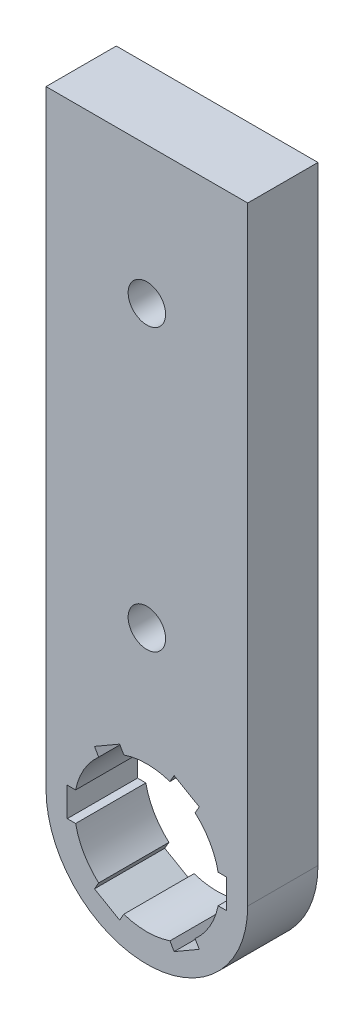
ISO-10303-21;
HEADER;
FILE_DESCRIPTION(('STEP AP214'),'2;1');
FILE_NAME('part.step','',(''),(''),'','','');
FILE_SCHEMA(('AUTOMOTIVE_DESIGN { 1 0 10303 214 1 1 1 1 }'));
ENDSEC;
DATA;
#1=APPLICATION_CONTEXT('core data for automotive mechanical design processes');
#2=APPLICATION_PROTOCOL_DEFINITION('international standard','automotive_design',2000,#1);
#3=PRODUCT_CONTEXT('',#1,'mechanical');
#4=PRODUCT('Part','Part','',(#3));
#5=PRODUCT_RELATED_PRODUCT_CATEGORY('part','',(#4));
#6=PRODUCT_DEFINITION_FORMATION('','',#4);
#7=PRODUCT_DEFINITION_CONTEXT('part definition',#1,'design');
#8=PRODUCT_DEFINITION('design','',#6,#7);
#9=PRODUCT_DEFINITION_SHAPE('','',#8);
#10=(LENGTH_UNIT() NAMED_UNIT(*) SI_UNIT(.MILLI.,.METRE.));
#11=(NAMED_UNIT(*) PLANE_ANGLE_UNIT() SI_UNIT($,.RADIAN.));
#12=(NAMED_UNIT(*) SI_UNIT($,.STERADIAN.) SOLID_ANGLE_UNIT());
#13=UNCERTAINTY_MEASURE_WITH_UNIT(LENGTH_MEASURE(1.E-05),#10,'distance_accuracy_value','');
#14=(GEOMETRIC_REPRESENTATION_CONTEXT(3) GLOBAL_UNCERTAINTY_ASSIGNED_CONTEXT((#13)) GLOBAL_UNIT_ASSIGNED_CONTEXT((#10,
#11,#12)) REPRESENTATION_CONTEXT('',''));
#15=CARTESIAN_POINT('',(0.,0.,0.));
#16=DIRECTION('',(0.,0.,1.));
#17=DIRECTION('',(1.,0.,0.));
#18=AXIS2_PLACEMENT_3D('',#15,#16,#17);
#19=CARTESIAN_POINT('',(0.,-32.5,7.5));
#20=DIRECTION('',(0.,0.,1.));
#21=DIRECTION('',(1.,0.,0.));
#22=AXIS2_PLACEMENT_3D('',#19,#20,#21);
#23=PLANE('',#22);
#24=CARTESIAN_POINT('',(0.,-12.165,7.5));
#25=DIRECTION('',(0.,0.,1.));
#26=DIRECTION('',(-1.,0.,0.));
#27=AXIS2_PLACEMENT_3D('',#24,#25,#26);
#28=CIRCLE('',#27,2.);
#29=CARTESIAN_POINT('',(-2.,-12.165,7.5));
#30=VERTEX_POINT('',#29);
#31=EDGE_CURVE('E719',#30,#30,#28,.T.);
#32=ORIENTED_EDGE('',*,*,#31,.F.);
#33=EDGE_LOOP('',(#32));
#34=FACE_BOUND('',#33,.T.);
#35=CARTESIAN_POINT('',(0.,-32.5,7.5));
#36=DIRECTION('',(0.,0.,1.));
#37=DIRECTION('',(1.,0.,0.));
#38=AXIS2_PLACEMENT_3D('',#35,#36,#37);
#39=CIRCLE('',#38,10.765);
#40=CARTESIAN_POINT('',(-10.765,-32.5,7.5));
#41=VERTEX_POINT('',#40);
#42=CARTESIAN_POINT('',(10.765,-32.5,7.5));
#43=VERTEX_POINT('',#42);
#44=EDGE_CURVE('E689',#41,#43,#39,.T.);
#45=ORIENTED_EDGE('',*,*,#44,.T.);
#46=DIRECTION('',(0.,1.,0.));
#47=VECTOR('',#46,1.);
#48=CARTESIAN_POINT('',(10.765,32.5,7.5));
#49=LINE('',#48,#47);
#50=CARTESIAN_POINT('',(10.765,32.5,7.5));
#51=VERTEX_POINT('',#50);
#52=EDGE_CURVE('E706',#43,#51,#49,.T.);
#53=ORIENTED_EDGE('',*,*,#52,.T.);
#54=DIRECTION('',(-1.,0.,0.));
#55=VECTOR('',#54,1.);
#56=CARTESIAN_POINT('',(-10.765,32.5,7.5));
#57=LINE('',#56,#55);
#58=CARTESIAN_POINT('',(-10.765,32.5,7.5));
#59=VERTEX_POINT('',#58);
#60=EDGE_CURVE('E681',#51,#59,#57,.T.);
#61=ORIENTED_EDGE('',*,*,#60,.T.);
#62=DIRECTION('',(0.,-1.,0.));
#63=VECTOR('',#62,1.);
#64=CARTESIAN_POINT('',(-10.765,32.5,7.5));
#65=LINE('',#64,#63);
#66=EDGE_CURVE('E697',#59,#41,#65,.T.);
#67=ORIENTED_EDGE('',*,*,#66,.T.);
#68=EDGE_LOOP('',(#45,#53,#61,#67));
#69=FACE_BOUND('',#68,.T.);
#70=CARTESIAN_POINT('',(0.,17.835,7.5));
#71=DIRECTION('',(0.,0.,1.));
#72=DIRECTION('',(1.,0.,0.));
#73=AXIS2_PLACEMENT_3D('',#70,#71,#72);
#74=CIRCLE('',#73,2.);
#75=CARTESIAN_POINT('',(2.,17.835,7.5));
#76=VERTEX_POINT('',#75);
#77=EDGE_CURVE('E710',#76,#76,#74,.T.);
#78=ORIENTED_EDGE('',*,*,#77,.F.);
#79=EDGE_LOOP('',(#78));
#80=FACE_BOUND('',#79,.T.);
#81=DIRECTION('',(0.,1.,0.));
#82=VECTOR('',#81,1.);
#83=CARTESIAN_POINT('',(-8.50000000000002,0.,7.5));
#84=LINE('',#83,#82);
#85=CARTESIAN_POINT('',(-8.50000000000004,-34.05,7.5));
#86=VERTEX_POINT('',#85);
#87=CARTESIAN_POINT('',(-8.50000000000004,-30.95,7.5));
#88=VERTEX_POINT('',#87);
#89=EDGE_CURVE('E406',#86,#88,#84,.T.);
#90=ORIENTED_EDGE('',*,*,#89,.T.);
#91=DIRECTION('',(1.,0.,0.));
#92=VECTOR('',#91,1.);
#93=CARTESIAN_POINT('',(0.,-30.95,7.5));
#94=LINE('',#93,#92);
#95=CARTESIAN_POINT('',(-7.60872689745145,-30.95,7.5));
#96=VERTEX_POINT('',#95);
#97=EDGE_CURVE('E401',#88,#96,#94,.T.);
#98=ORIENTED_EDGE('',*,*,#97,.T.);
#99=CARTESIAN_POINT('',(0.,-32.5,7.5));
#100=DIRECTION('',(0.,0.,1.));
#101=DIRECTION('',(1.,0.,0.));
#102=AXIS2_PLACEMENT_3D('',#99,#100,#101);
#103=CIRCLE('',#102,7.76500000000004);
#104=CARTESIAN_POINT('',(-5.14670282459161,-26.6856492163491,7.5));
#105=VERTEX_POINT('',#104);
#106=EDGE_CURVE('E359',#105,#96,#103,.T.);
#107=ORIENTED_EDGE('',*,*,#106,.F.);
#108=DIRECTION('',(0.499999999999999,-0.86602540378444,0.));
#109=VECTOR('',#108,1.);
#110=CARTESIAN_POINT('',(-15.415252187363,-8.89999999999996,7.5));
#111=LINE('',#110,#109);
#112=CARTESIAN_POINT('',(-5.5923393758659,-25.9137840678323,7.5));
#113=VERTEX_POINT('',#112);
#114=EDGE_CURVE('E334',#113,#105,#111,.T.);
#115=ORIENTED_EDGE('',*,*,#114,.F.);
#116=DIRECTION('',(0.86602540378444,0.499999999999998,0.));
#117=VECTOR('',#116,1.);
#118=CARTESIAN_POINT('',(9.8229128114971,-17.0137840678323,7.5));
#119=LINE('',#118,#117);
#120=CARTESIAN_POINT('',(-2.90766062413413,-24.3637840678323,7.5));
#121=VERTEX_POINT('',#120);
#122=EDGE_CURVE('E606',#113,#121,#119,.T.);
#123=ORIENTED_EDGE('',*,*,#122,.T.);
#124=DIRECTION('',(0.499999999999998,-0.86602540378444,0.));
#125=VECTOR('',#124,1.);
#126=CARTESIAN_POINT('',(-12.7305734356312,-7.34999999999994,7.5));
#127=LINE('',#126,#125);
#128=CARTESIAN_POINT('',(-2.46202407285984,-25.1356492163491,7.5));
#129=VERTEX_POINT('',#128);
#130=EDGE_CURVE('E602',#121,#129,#127,.T.);
#131=ORIENTED_EDGE('',*,*,#130,.T.);
#132=CARTESIAN_POINT('',(2.46202407285982,-25.1356492163491,7.5));
#133=VERTEX_POINT('',#132);
#134=EDGE_CURVE('E328',#133,#129,#103,.T.);
#135=ORIENTED_EDGE('',*,*,#134,.F.);
#136=DIRECTION('',(-0.500000000000004,-0.866025403784437,0.));
#137=VECTOR('',#136,1.);
#138=CARTESIAN_POINT('',(12.7305734356313,-7.3500000000001,7.5));
#139=LINE('',#138,#137);
#140=CARTESIAN_POINT('',(2.90766062413413,-24.3637840678323,7.5));
#141=VERTEX_POINT('',#140);
#142=EDGE_CURVE('E545',#141,#133,#139,.T.);
#143=ORIENTED_EDGE('',*,*,#142,.F.);
#144=DIRECTION('',(0.866025403784436,-0.500000000000004,0.));
#145=VECTOR('',#144,1.);
#146=CARTESIAN_POINT('',(-9.82291281149717,-17.0137840678322,7.5));
#147=LINE('',#146,#145);
#148=CARTESIAN_POINT('',(5.59233937586589,-25.9137840678323,7.5));
#149=VERTEX_POINT('',#148);
#150=EDGE_CURVE('E541',#141,#149,#147,.T.);
#151=ORIENTED_EDGE('',*,*,#150,.T.);
#152=DIRECTION('',(-0.500000000000004,-0.866025403784436,0.));
#153=VECTOR('',#152,1.);
#154=CARTESIAN_POINT('',(15.4152521873631,-8.90000000000012,7.5));
#155=LINE('',#154,#153);
#156=CARTESIAN_POINT('',(5.14670282459158,-26.6856492163492,7.5));
#157=VERTEX_POINT('',#156);
#158=EDGE_CURVE('E537',#149,#157,#155,.T.);
#159=ORIENTED_EDGE('',*,*,#158,.T.);
#160=CARTESIAN_POINT('',(7.60872689745138,-30.95,7.5));
#161=VERTEX_POINT('',#160);
#162=EDGE_CURVE('E361',#161,#157,#103,.T.);
#163=ORIENTED_EDGE('',*,*,#162,.F.);
#164=DIRECTION('',(1.,0.,0.));
#165=VECTOR('',#164,1.);
#166=CARTESIAN_POINT('',(0.,-30.95,7.5));
#167=LINE('',#166,#165);
#168=CARTESIAN_POINT('',(8.49999999999996,-30.95,7.5));
#169=VERTEX_POINT('',#168);
#170=EDGE_CURVE('E150',#161,#169,#167,.T.);
#171=ORIENTED_EDGE('',*,*,#170,.T.);
#172=DIRECTION('',(0.,1.,0.));
#173=VECTOR('',#172,1.);
#174=CARTESIAN_POINT('',(8.49999999999996,0.,7.5));
#175=LINE('',#174,#173);
#176=CARTESIAN_POINT('',(8.49999999999996,-34.05,7.5));
#177=VERTEX_POINT('',#176);
#178=EDGE_CURVE('E513',#177,#169,#175,.T.);
#179=ORIENTED_EDGE('',*,*,#178,.F.);
#180=DIRECTION('',(1.,0.,0.));
#181=VECTOR('',#180,1.);
#182=CARTESIAN_POINT('',(0.,-34.05,7.5));
#183=LINE('',#182,#181);
#184=CARTESIAN_POINT('',(7.60872689745138,-34.05,7.5));
#185=VERTEX_POINT('',#184);
#186=EDGE_CURVE('E509',#185,#177,#183,.T.);
#187=ORIENTED_EDGE('',*,*,#186,.F.);
#188=CARTESIAN_POINT('',(5.14670282459154,-38.3143507836509,7.5));
#189=VERTEX_POINT('',#188);
#190=EDGE_CURVE('E572',#189,#185,#103,.T.);
#191=ORIENTED_EDGE('',*,*,#190,.F.);
#192=DIRECTION('',(0.499999999999998,-0.86602540378444,0.));
#193=VECTOR('',#192,1.);
#194=CARTESIAN_POINT('',(-12.7305734356312,-7.34999999999994,7.5));
#195=LINE('',#194,#193);
#196=CARTESIAN_POINT('',(5.59233937586584,-39.0862159321677,7.5));
#197=VERTEX_POINT('',#196);
#198=EDGE_CURVE('E482',#189,#197,#195,.T.);
#199=ORIENTED_EDGE('',*,*,#198,.T.);
#200=DIRECTION('',(0.866025403784439,0.499999999999999,0.));
#201=VECTOR('',#200,1.);
#202=CARTESIAN_POINT('',(18.3229128114971,-31.7362159321678,7.5));
#203=LINE('',#202,#201);
#204=CARTESIAN_POINT('',(2.90766062413408,-40.6362159321677,7.5));
#205=VERTEX_POINT('',#204);
#206=EDGE_CURVE('E478',#205,#197,#203,.T.);
#207=ORIENTED_EDGE('',*,*,#206,.F.);
#208=DIRECTION('',(0.499999999999999,-0.86602540378444,0.));
#209=VECTOR('',#208,1.);
#210=CARTESIAN_POINT('',(-15.415252187363,-8.89999999999996,7.5));
#211=LINE('',#210,#209);
#212=CARTESIAN_POINT('',(2.46202407285978,-39.8643507836509,7.5));
#213=VERTEX_POINT('',#212);
#214=EDGE_CURVE('E474',#213,#205,#211,.T.);
#215=ORIENTED_EDGE('',*,*,#214,.F.);
#216=CARTESIAN_POINT('',(-2.46202407285989,-39.8643507836509,7.5));
#217=VERTEX_POINT('',#216);
#218=EDGE_CURVE('E574',#217,#213,#103,.T.);
#219=ORIENTED_EDGE('',*,*,#218,.F.);
#220=DIRECTION('',(-0.500000000000004,-0.866025403784436,0.));
#221=VECTOR('',#220,1.);
#222=CARTESIAN_POINT('',(15.4152521873631,-8.90000000000012,7.5));
#223=LINE('',#222,#221);
#224=CARTESIAN_POINT('',(-2.90766062413419,-40.6362159321677,7.5));
#225=VERTEX_POINT('',#224);
#226=EDGE_CURVE('E449',#217,#225,#223,.T.);
#227=ORIENTED_EDGE('',*,*,#226,.T.);
#228=DIRECTION('',(0.866025403784436,-0.500000000000005,0.));
#229=VECTOR('',#228,1.);
#230=CARTESIAN_POINT('',(-18.3229128114973,-31.7362159321675,7.5));
#231=LINE('',#230,#229);
#232=CARTESIAN_POINT('',(-5.59233937586594,-39.0862159321677,7.5));
#233=VERTEX_POINT('',#232);
#234=EDGE_CURVE('E445',#233,#225,#231,.T.);
#235=ORIENTED_EDGE('',*,*,#234,.F.);
#236=DIRECTION('',(-0.500000000000004,-0.866025403784437,0.));
#237=VECTOR('',#236,1.);
#238=CARTESIAN_POINT('',(12.7305734356313,-7.3500000000001,7.5));
#239=LINE('',#238,#237);
#240=CARTESIAN_POINT('',(-5.14670282459165,-38.3143507836509,7.5));
#241=VERTEX_POINT('',#240);
#242=EDGE_CURVE('E441',#241,#233,#239,.T.);
#243=ORIENTED_EDGE('',*,*,#242,.F.);
#244=CARTESIAN_POINT('',(-7.60872689745145,-34.05,7.5));
#245=VERTEX_POINT('',#244);
#246=EDGE_CURVE('E577',#245,#241,#103,.T.);
#247=ORIENTED_EDGE('',*,*,#246,.F.);
#248=DIRECTION('',(1.,0.,0.));
#249=VECTOR('',#248,1.);
#250=CARTESIAN_POINT('',(0.,-34.05,7.5));
#251=LINE('',#250,#249);
#252=EDGE_CURVE('E414',#86,#245,#251,.T.);
#253=ORIENTED_EDGE('',*,*,#252,.F.);
#254=EDGE_LOOP('',(#90,#98,#107,#115,#123,#131,#135,#143,#151,#159,#163,#171,#179,#187,#191,
#199,#207,#215,#219,#227,#235,#243,#247,#253));
#255=FACE_BOUND('',#254,.T.);
#256=ADVANCED_FACE('F134',(#34,#69,#80,#255),#23,.T.);
#257=CARTESIAN_POINT('',(0.,-32.5,0.));
#258=DIRECTION('',(0.,0.,1.));
#259=DIRECTION('',(1.,0.,0.));
#260=AXIS2_PLACEMENT_3D('',#257,#258,#259);
#261=PLANE('',#260);
#262=CARTESIAN_POINT('',(0.,-12.165,0.));
#263=DIRECTION('',(0.,0.,1.));
#264=DIRECTION('',(-1.,0.,0.));
#265=AXIS2_PLACEMENT_3D('',#262,#263,#264);
#266=CIRCLE('',#265,2.);
#267=CARTESIAN_POINT('',(-2.,-12.165,0.));
#268=VERTEX_POINT('',#267);
#269=EDGE_CURVE('E343',#268,#268,#266,.T.);
#270=ORIENTED_EDGE('',*,*,#269,.T.);
#271=EDGE_LOOP('',(#270));
#272=FACE_BOUND('',#271,.T.);
#273=CARTESIAN_POINT('',(0.,17.835,0.));
#274=DIRECTION('',(0.,0.,1.));
#275=DIRECTION('',(1.,0.,0.));
#276=AXIS2_PLACEMENT_3D('',#273,#274,#275);
#277=CIRCLE('',#276,2.);
#278=CARTESIAN_POINT('',(2.,17.835,0.));
#279=VERTEX_POINT('',#278);
#280=EDGE_CURVE('E713',#279,#279,#277,.T.);
#281=ORIENTED_EDGE('',*,*,#280,.T.);
#282=EDGE_LOOP('',(#281));
#283=FACE_BOUND('',#282,.T.);
#284=CARTESIAN_POINT('',(0.,-32.5,0.));
#285=DIRECTION('',(0.,0.,1.));
#286=DIRECTION('',(1.,0.,0.));
#287=AXIS2_PLACEMENT_3D('',#284,#285,#286);
#288=CIRCLE('',#287,10.765);
#289=CARTESIAN_POINT('',(-10.765,-32.5,0.));
#290=VERTEX_POINT('',#289);
#291=CARTESIAN_POINT('',(10.765,-32.5,0.));
#292=VERTEX_POINT('',#291);
#293=EDGE_CURVE('E677',#290,#292,#288,.T.);
#294=ORIENTED_EDGE('',*,*,#293,.F.);
#295=DIRECTION('',(0.,-1.,0.));
#296=VECTOR('',#295,1.);
#297=CARTESIAN_POINT('',(-10.765,32.5,0.));
#298=LINE('',#297,#296);
#299=CARTESIAN_POINT('',(-10.765,32.5,0.));
#300=VERTEX_POINT('',#299);
#301=EDGE_CURVE('E685',#300,#290,#298,.T.);
#302=ORIENTED_EDGE('',*,*,#301,.F.);
#303=DIRECTION('',(-1.,0.,0.));
#304=VECTOR('',#303,1.);
#305=CARTESIAN_POINT('',(-10.765,32.5,0.));
#306=LINE('',#305,#304);
#307=CARTESIAN_POINT('',(10.765,32.5,0.));
#308=VERTEX_POINT('',#307);
#309=EDGE_CURVE('E676',#308,#300,#306,.T.);
#310=ORIENTED_EDGE('',*,*,#309,.F.);
#311=DIRECTION('',(0.,1.,0.));
#312=VECTOR('',#311,1.);
#313=CARTESIAN_POINT('',(10.765,32.5,0.));
#314=LINE('',#313,#312);
#315=EDGE_CURVE('E667',#292,#308,#314,.T.);
#316=ORIENTED_EDGE('',*,*,#315,.F.);
#317=EDGE_LOOP('',(#294,#302,#310,#316));
#318=FACE_BOUND('',#317,.T.);
#319=DIRECTION('',(-1.,0.,0.));
#320=VECTOR('',#319,1.);
#321=CARTESIAN_POINT('',(0.,-30.95,0.));
#322=LINE('',#321,#320);
#323=CARTESIAN_POINT('',(-7.60872689745145,-30.95,0.));
#324=VERTEX_POINT('',#323);
#325=CARTESIAN_POINT('',(-8.50000000000004,-30.95,0.));
#326=VERTEX_POINT('',#325);
#327=EDGE_CURVE('E420',#324,#326,#322,.T.);
#328=ORIENTED_EDGE('',*,*,#327,.T.);
#329=DIRECTION('',(0.,-1.,0.));
#330=VECTOR('',#329,1.);
#331=CARTESIAN_POINT('',(-8.50000000000002,0.,0.));
#332=LINE('',#331,#330);
#333=CARTESIAN_POINT('',(-8.50000000000004,-34.05,0.));
#334=VERTEX_POINT('',#333);
#335=EDGE_CURVE('E397',#326,#334,#332,.T.);
#336=ORIENTED_EDGE('',*,*,#335,.T.);
#337=DIRECTION('',(-1.,0.,0.));
#338=VECTOR('',#337,1.);
#339=CARTESIAN_POINT('',(0.,-34.05,0.));
#340=LINE('',#339,#338);
#341=CARTESIAN_POINT('',(-7.60872689745145,-34.05,0.));
#342=VERTEX_POINT('',#341);
#343=EDGE_CURVE('E396',#342,#334,#340,.T.);
#344=ORIENTED_EDGE('',*,*,#343,.F.);
#345=CARTESIAN_POINT('',(0.,-32.5,0.));
#346=DIRECTION('',(0.,0.,1.));
#347=DIRECTION('',(1.,0.,0.));
#348=AXIS2_PLACEMENT_3D('',#345,#346,#347);
#349=CIRCLE('',#348,7.76500000000004);
#350=CARTESIAN_POINT('',(-5.14670282459164,-38.3143507836509,0.));
#351=VERTEX_POINT('',#350);
#352=EDGE_CURVE('E358',#351,#342,#349,.F.);
#353=ORIENTED_EDGE('',*,*,#352,.F.);
#354=DIRECTION('',(0.500000000000004,0.866025403784437,0.));
#355=VECTOR('',#354,1.);
#356=CARTESIAN_POINT('',(12.7305734356313,-7.3500000000001,0.));
#357=LINE('',#356,#355);
#358=CARTESIAN_POINT('',(-5.59233937586594,-39.0862159321677,0.));
#359=VERTEX_POINT('',#358);
#360=EDGE_CURVE('E408',#359,#351,#357,.T.);
#361=ORIENTED_EDGE('',*,*,#360,.F.);
#362=DIRECTION('',(-0.866025403784436,0.500000000000005,0.));
#363=VECTOR('',#362,1.);
#364=CARTESIAN_POINT('',(-18.3229128114973,-31.7362159321675,0.));
#365=LINE('',#364,#363);
#366=CARTESIAN_POINT('',(-2.90766062413419,-40.6362159321677,0.));
#367=VERTEX_POINT('',#366);
#368=EDGE_CURVE('E433',#367,#359,#365,.T.);
#369=ORIENTED_EDGE('',*,*,#368,.F.);
#370=DIRECTION('',(0.500000000000004,0.866025403784436,0.));
#371=VECTOR('',#370,1.);
#372=CARTESIAN_POINT('',(15.4152521873631,-8.90000000000012,0.));
#373=LINE('',#372,#371);
#374=CARTESIAN_POINT('',(-2.46202407285989,-39.8643507836509,0.));
#375=VERTEX_POINT('',#374);
#376=EDGE_CURVE('E437',#367,#375,#373,.T.);
#377=ORIENTED_EDGE('',*,*,#376,.T.);
#378=CARTESIAN_POINT('',(2.46202407285978,-39.8643507836509,0.));
#379=VERTEX_POINT('',#378);
#380=EDGE_CURVE('E374',#379,#375,#349,.F.);
#381=ORIENTED_EDGE('',*,*,#380,.F.);
#382=DIRECTION('',(-0.499999999999999,0.866025403784439,0.));
#383=VECTOR('',#382,1.);
#384=CARTESIAN_POINT('',(-15.415252187363,-8.89999999999996,0.));
#385=LINE('',#384,#383);
#386=CARTESIAN_POINT('',(2.90766062413408,-40.6362159321677,0.));
#387=VERTEX_POINT('',#386);
#388=EDGE_CURVE('E438',#387,#379,#385,.T.);
#389=ORIENTED_EDGE('',*,*,#388,.F.);
#390=DIRECTION('',(-0.866025403784439,-0.499999999999999,0.));
#391=VECTOR('',#390,1.);
#392=CARTESIAN_POINT('',(18.3229128114971,-31.7362159321678,0.));
#393=LINE('',#392,#391);
#394=CARTESIAN_POINT('',(5.59233937586584,-39.0862159321677,0.));
#395=VERTEX_POINT('',#394);
#396=EDGE_CURVE('E466',#395,#387,#393,.T.);
#397=ORIENTED_EDGE('',*,*,#396,.F.);
#398=DIRECTION('',(-0.499999999999998,0.86602540378444,0.));
#399=VECTOR('',#398,1.);
#400=CARTESIAN_POINT('',(-12.7305734356312,-7.34999999999994,0.));
#401=LINE('',#400,#399);
#402=CARTESIAN_POINT('',(5.14670282459154,-38.3143507836509,0.));
#403=VERTEX_POINT('',#402);
#404=EDGE_CURVE('E470',#395,#403,#401,.T.);
#405=ORIENTED_EDGE('',*,*,#404,.T.);
#406=CARTESIAN_POINT('',(7.60872689745138,-34.05,0.));
#407=VERTEX_POINT('',#406);
#408=EDGE_CURVE('E366',#407,#403,#349,.F.);
#409=ORIENTED_EDGE('',*,*,#408,.F.);
#410=DIRECTION('',(-1.,0.,0.));
#411=VECTOR('',#410,1.);
#412=CARTESIAN_POINT('',(0.,-34.05,0.));
#413=LINE('',#412,#411);
#414=CARTESIAN_POINT('',(8.49999999999996,-34.05,0.));
#415=VERTEX_POINT('',#414);
#416=EDGE_CURVE('E471',#415,#407,#413,.T.);
#417=ORIENTED_EDGE('',*,*,#416,.F.);
#418=DIRECTION('',(0.,-1.,0.));
#419=VECTOR('',#418,1.);
#420=CARTESIAN_POINT('',(8.49999999999996,0.,0.));
#421=LINE('',#420,#419);
#422=CARTESIAN_POINT('',(8.49999999999996,-30.95,0.));
#423=VERTEX_POINT('',#422);
#424=EDGE_CURVE('E502',#423,#415,#421,.T.);
#425=ORIENTED_EDGE('',*,*,#424,.F.);
#426=DIRECTION('',(-1.,0.,0.));
#427=VECTOR('',#426,1.);
#428=CARTESIAN_POINT('',(0.,-30.95,0.));
#429=LINE('',#428,#427);
#430=CARTESIAN_POINT('',(7.60872689745138,-30.95,0.));
#431=VERTEX_POINT('',#430);
#432=EDGE_CURVE('E506',#423,#431,#429,.T.);
#433=ORIENTED_EDGE('',*,*,#432,.T.);
#434=CARTESIAN_POINT('',(5.14670282459158,-26.6856492163491,0.));
#435=VERTEX_POINT('',#434);
#436=EDGE_CURVE('E354',#435,#431,#349,.F.);
#437=ORIENTED_EDGE('',*,*,#436,.F.);
#438=DIRECTION('',(0.500000000000004,0.866025403784436,0.));
#439=VECTOR('',#438,1.);
#440=CARTESIAN_POINT('',(15.4152521873631,-8.90000000000012,0.));
#441=LINE('',#440,#439);
#442=CARTESIAN_POINT('',(5.59233937586589,-25.9137840678323,0.));
#443=VERTEX_POINT('',#442);
#444=EDGE_CURVE('E158',#435,#443,#441,.T.);
#445=ORIENTED_EDGE('',*,*,#444,.T.);
#446=DIRECTION('',(-0.866025403784436,0.500000000000004,0.));
#447=VECTOR('',#446,1.);
#448=CARTESIAN_POINT('',(-9.82291281149717,-17.0137840678322,0.));
#449=LINE('',#448,#447);
#450=CARTESIAN_POINT('',(2.90766062413413,-24.3637840678323,0.));
#451=VERTEX_POINT('',#450);
#452=EDGE_CURVE('E365',#443,#451,#449,.T.);
#453=ORIENTED_EDGE('',*,*,#452,.T.);
#454=DIRECTION('',(0.500000000000004,0.866025403784437,0.));
#455=VECTOR('',#454,1.);
#456=CARTESIAN_POINT('',(12.7305734356313,-7.3500000000001,0.));
#457=LINE('',#456,#455);
#458=CARTESIAN_POINT('',(2.46202407285982,-25.1356492163491,0.));
#459=VERTEX_POINT('',#458);
#460=EDGE_CURVE('E350',#459,#451,#457,.T.);
#461=ORIENTED_EDGE('',*,*,#460,.F.);
#462=CARTESIAN_POINT('',(-2.46202407285983,-25.1356492163491,0.));
#463=VERTEX_POINT('',#462);
#464=EDGE_CURVE('E325',#463,#459,#349,.F.);
#465=ORIENTED_EDGE('',*,*,#464,.F.);
#466=DIRECTION('',(-0.499999999999998,0.86602540378444,0.));
#467=VECTOR('',#466,1.);
#468=CARTESIAN_POINT('',(-12.7305734356312,-7.34999999999994,0.));
#469=LINE('',#468,#467);
#470=CARTESIAN_POINT('',(-2.90766062413413,-24.3637840678323,0.));
#471=VERTEX_POINT('',#470);
#472=EDGE_CURVE('E338',#463,#471,#469,.T.);
#473=ORIENTED_EDGE('',*,*,#472,.T.);
#474=DIRECTION('',(-0.86602540378444,-0.499999999999998,0.));
#475=VECTOR('',#474,1.);
#476=CARTESIAN_POINT('',(9.8229128114971,-17.0137840678323,0.));
#477=LINE('',#476,#475);
#478=CARTESIAN_POINT('',(-5.5923393758659,-25.9137840678323,0.));
#479=VERTEX_POINT('',#478);
#480=EDGE_CURVE('E432',#471,#479,#477,.T.);
#481=ORIENTED_EDGE('',*,*,#480,.T.);
#482=DIRECTION('',(-0.499999999999999,0.866025403784439,0.));
#483=VECTOR('',#482,1.);
#484=CARTESIAN_POINT('',(-15.415252187363,-8.89999999999996,0.));
#485=LINE('',#484,#483);
#486=CARTESIAN_POINT('',(-5.14670282459161,-26.6856492163491,0.));
#487=VERTEX_POINT('',#486);
#488=EDGE_CURVE('E598',#487,#479,#485,.T.);
#489=ORIENTED_EDGE('',*,*,#488,.F.);
#490=EDGE_CURVE('E352',#324,#487,#349,.F.);
#491=ORIENTED_EDGE('',*,*,#490,.F.);
#492=EDGE_LOOP('',(#328,#336,#344,#353,#361,#369,#377,#381,#389,#397,#405,#409,#417,#425,#433,
#437,#445,#453,#461,#465,#473,#481,#489,#491));
#493=FACE_BOUND('',#492,.T.);
#494=ADVANCED_FACE('F348',(#272,#283,#318,#493),#261,.F.);
#495=CARTESIAN_POINT('',(0.,-32.5,7.5));
#496=DIRECTION('',(0.,0.,-1.));
#497=DIRECTION('',(-1.,0.,0.));
#498=AXIS2_PLACEMENT_3D('',#495,#496,#497);
#499=CYLINDRICAL_SURFACE('',#498,10.765);
#500=ORIENTED_EDGE('',*,*,#293,.T.);
#501=DIRECTION('',(0.,0.,-1.));
#502=VECTOR('',#501,1.);
#503=CARTESIAN_POINT('',(10.765,-32.5,7.5));
#504=LINE('',#503,#502);
#505=EDGE_CURVE('E12',#43,#292,#504,.T.);
#506=ORIENTED_EDGE('',*,*,#505,.F.);
#507=ORIENTED_EDGE('',*,*,#44,.F.);
#508=DIRECTION('',(0.,0.,-1.));
#509=VECTOR('',#508,1.);
#510=CARTESIAN_POINT('',(-10.765,-32.5,7.5));
#511=LINE('',#510,#509);
#512=EDGE_CURVE('E693',#41,#290,#511,.T.);
#513=ORIENTED_EDGE('',*,*,#512,.T.);
#514=EDGE_LOOP('',(#500,#506,#507,#513));
#515=FACE_BOUND('',#514,.T.);
#516=ADVANCED_FACE('F136',(#515),#499,.T.);
#517=CARTESIAN_POINT('',(10.765,32.5,7.5));
#518=DIRECTION('',(-1.,0.,0.));
#519=DIRECTION('',(0.,-1.,0.));
#520=AXIS2_PLACEMENT_3D('',#517,#518,#519);
#521=PLANE('',#520);
#522=ORIENTED_EDGE('',*,*,#315,.T.);
#523=DIRECTION('',(0.,0.,-1.));
#524=VECTOR('',#523,1.);
#525=CARTESIAN_POINT('',(10.765,32.5,7.5));
#526=LINE('',#525,#524);
#527=EDGE_CURVE('E143',#51,#308,#526,.T.);
#528=ORIENTED_EDGE('',*,*,#527,.F.);
#529=ORIENTED_EDGE('',*,*,#52,.F.);
#530=ORIENTED_EDGE('',*,*,#505,.T.);
#531=EDGE_LOOP('',(#522,#528,#529,#530));
#532=FACE_BOUND('',#531,.T.);
#533=ADVANCED_FACE('F658',(#532),#521,.F.);
#534=CARTESIAN_POINT('',(-10.765,32.5,7.5));
#535=DIRECTION('',(0.,-1.,0.));
#536=DIRECTION('',(0.,0.,-1.));
#537=AXIS2_PLACEMENT_3D('',#534,#535,#536);
#538=PLANE('',#537);
#539=ORIENTED_EDGE('',*,*,#309,.T.);
#540=DIRECTION('',(0.,0.,-1.));
#541=VECTOR('',#540,1.);
#542=CARTESIAN_POINT('',(-10.765,32.5,7.5));
#543=LINE('',#542,#541);
#544=EDGE_CURVE('E683',#59,#300,#543,.T.);
#545=ORIENTED_EDGE('',*,*,#544,.F.);
#546=ORIENTED_EDGE('',*,*,#60,.F.);
#547=ORIENTED_EDGE('',*,*,#527,.T.);
#548=EDGE_LOOP('',(#539,#545,#546,#547));
#549=FACE_BOUND('',#548,.T.);
#550=ADVANCED_FACE('F655',(#549),#538,.F.);
#551=CARTESIAN_POINT('',(-10.765,32.5,7.5));
#552=DIRECTION('',(1.,0.,0.));
#553=DIRECTION('',(0.,1.,0.));
#554=AXIS2_PLACEMENT_3D('',#551,#552,#553);
#555=PLANE('',#554);
#556=ORIENTED_EDGE('',*,*,#301,.T.);
#557=ORIENTED_EDGE('',*,*,#512,.F.);
#558=ORIENTED_EDGE('',*,*,#66,.F.);
#559=ORIENTED_EDGE('',*,*,#544,.T.);
#560=EDGE_LOOP('',(#556,#557,#558,#559));
#561=FACE_BOUND('',#560,.T.);
#562=ADVANCED_FACE('F652',(#561),#555,.F.);
#563=CARTESIAN_POINT('',(0.,17.835,7.5));
#564=DIRECTION('',(0.,0.,-1.));
#565=DIRECTION('',(-1.,0.,0.));
#566=AXIS2_PLACEMENT_3D('',#563,#564,#565);
#567=CYLINDRICAL_SURFACE('',#566,2.);
#568=ORIENTED_EDGE('',*,*,#77,.T.);
#569=EDGE_LOOP('',(#568));
#570=FACE_BOUND('',#569,.T.);
#571=ORIENTED_EDGE('',*,*,#280,.F.);
#572=EDGE_LOOP('',(#571));
#573=FACE_BOUND('',#572,.T.);
#574=ADVANCED_FACE('F634',(#570,#573),#567,.F.);
#575=CARTESIAN_POINT('',(0.,-12.165,7.5));
#576=DIRECTION('',(0.,0.,-1.));
#577=DIRECTION('',(-1.,0.,0.));
#578=AXIS2_PLACEMENT_3D('',#575,#576,#577);
#579=CYLINDRICAL_SURFACE('',#578,2.);
#580=ORIENTED_EDGE('',*,*,#31,.T.);
#581=EDGE_LOOP('',(#580));
#582=FACE_BOUND('',#581,.T.);
#583=ORIENTED_EDGE('',*,*,#269,.F.);
#584=EDGE_LOOP('',(#583));
#585=FACE_BOUND('',#584,.T.);
#586=ADVANCED_FACE('F626',(#582,#585),#579,.F.);
#587=CARTESIAN_POINT('',(-15.415252187363,-8.89999999999996,-0.00100000000000013));
#588=DIRECTION('',(-0.866025403784439,-0.499999999999999,0.));
#589=DIRECTION('',(0.499999999999999,-0.866025403784439,0.));
#590=AXIS2_PLACEMENT_3D('',#587,#588,#589);
#591=PLANE('',#590);
#592=ORIENTED_EDGE('',*,*,#488,.T.);
#593=DIRECTION('',(0.,0.,1.));
#594=VECTOR('',#593,1.);
#595=CARTESIAN_POINT('',(-5.5923393758659,-25.9137840678323,-0.00100000000000013));
#596=LINE('',#595,#594);
#597=EDGE_CURVE('E617',#479,#113,#596,.T.);
#598=ORIENTED_EDGE('',*,*,#597,.T.);
#599=ORIENTED_EDGE('',*,*,#114,.T.);
#600=DIRECTION('',(0.,0.,1.));
#601=VECTOR('',#600,1.);
#602=CARTESIAN_POINT('',(-5.14670282459161,-26.6856492163491,-0.00100000000000013));
#603=LINE('',#602,#601);
#604=EDGE_CURVE('E344',#487,#105,#603,.T.);
#605=ORIENTED_EDGE('',*,*,#604,.F.);
#606=EDGE_LOOP('',(#592,#598,#599,#605));
#607=FACE_BOUND('',#606,.T.);
#608=ADVANCED_FACE('F624',(#607),#591,.F.);
#609=CARTESIAN_POINT('',(9.8229128114971,-17.0137840678323,-0.00100000000000013));
#610=DIRECTION('',(0.499999999999998,-0.86602540378444,0.));
#611=DIRECTION('',(0.86602540378444,0.499999999999998,0.));
#612=AXIS2_PLACEMENT_3D('',#609,#610,#611);
#613=PLANE('',#612);
#614=DIRECTION('',(0.,0.,1.));
#615=VECTOR('',#614,1.);
#616=CARTESIAN_POINT('',(-2.90766062413413,-24.3637840678323,-0.00100000000000013));
#617=LINE('',#616,#615);
#618=EDGE_CURVE('E333',#471,#121,#617,.T.);
#619=ORIENTED_EDGE('',*,*,#618,.T.);
#620=ORIENTED_EDGE('',*,*,#122,.F.);
#621=ORIENTED_EDGE('',*,*,#597,.F.);
#622=ORIENTED_EDGE('',*,*,#480,.F.);
#623=EDGE_LOOP('',(#619,#620,#621,#622));
#624=FACE_BOUND('',#623,.T.);
#625=ADVANCED_FACE('F623',(#624),#613,.T.);
#626=CARTESIAN_POINT('',(-12.7305734356312,-7.34999999999994,-0.00100000000000013));
#627=DIRECTION('',(-0.86602540378444,-0.499999999999998,0.));
#628=DIRECTION('',(0.499999999999998,-0.86602540378444,0.));
#629=AXIS2_PLACEMENT_3D('',#626,#627,#628);
#630=PLANE('',#629);
#631=DIRECTION('',(0.,0.,1.));
#632=VECTOR('',#631,1.);
#633=CARTESIAN_POINT('',(-2.46202407285984,-25.1356492163491,-0.00100000000000013));
#634=LINE('',#633,#632);
#635=EDGE_CURVE('E321',#463,#129,#634,.T.);
#636=ORIENTED_EDGE('',*,*,#635,.T.);
#637=ORIENTED_EDGE('',*,*,#130,.F.);
#638=ORIENTED_EDGE('',*,*,#618,.F.);
#639=ORIENTED_EDGE('',*,*,#472,.F.);
#640=EDGE_LOOP('',(#636,#637,#638,#639));
#641=FACE_BOUND('',#640,.T.);
#642=ADVANCED_FACE('F339',(#641),#630,.T.);
#643=CARTESIAN_POINT('',(-8.50000000000002,0.,-0.00100000000000013));
#644=DIRECTION('',(1.,0.,0.));
#645=DIRECTION('',(0.,1.,0.));
#646=AXIS2_PLACEMENT_3D('',#643,#644,#645);
#647=PLANE('',#646);
#648=DIRECTION('',(0.,0.,1.));
#649=VECTOR('',#648,1.);
#650=CARTESIAN_POINT('',(-8.50000000000004,-30.95,-0.00100000000000013));
#651=LINE('',#650,#649);
#652=EDGE_CURVE('E424',#326,#88,#651,.T.);
#653=ORIENTED_EDGE('',*,*,#652,.T.);
#654=ORIENTED_EDGE('',*,*,#89,.F.);
#655=DIRECTION('',(0.,0.,1.));
#656=VECTOR('',#655,1.);
#657=CARTESIAN_POINT('',(-8.50000000000004,-34.05,-0.00100000000000013));
#658=LINE('',#657,#656);
#659=EDGE_CURVE('E421',#334,#86,#658,.T.);
#660=ORIENTED_EDGE('',*,*,#659,.F.);
#661=ORIENTED_EDGE('',*,*,#335,.F.);
#662=EDGE_LOOP('',(#653,#654,#660,#661));
#663=FACE_BOUND('',#662,.T.);
#664=ADVANCED_FACE('F596',(#663),#647,.T.);
#665=CARTESIAN_POINT('',(0.,-34.05,-0.00100000000000013));
#666=DIRECTION('',(0.,-1.,0.));
#667=DIRECTION('',(1.,0.,0.));
#668=AXIS2_PLACEMENT_3D('',#665,#666,#667);
#669=PLANE('',#668);
#670=ORIENTED_EDGE('',*,*,#343,.T.);
#671=ORIENTED_EDGE('',*,*,#659,.T.);
#672=ORIENTED_EDGE('',*,*,#252,.T.);
#673=DIRECTION('',(0.,0.,1.));
#674=VECTOR('',#673,1.);
#675=CARTESIAN_POINT('',(-7.60872689745145,-34.05,-0.00100000000000013));
#676=LINE('',#675,#674);
#677=EDGE_CURVE('E389',#342,#245,#676,.T.);
#678=ORIENTED_EDGE('',*,*,#677,.F.);
#679=EDGE_LOOP('',(#670,#671,#672,#678));
#680=FACE_BOUND('',#679,.T.);
#681=ADVANCED_FACE('F782',(#680),#669,.F.);
#682=CARTESIAN_POINT('',(12.7305734356313,-7.3500000000001,-0.00100000000000013));
#683=DIRECTION('',(-0.866025403784436,0.500000000000004,0.));
#684=DIRECTION('',(-0.500000000000004,-0.866025403784437,0.));
#685=AXIS2_PLACEMENT_3D('',#682,#683,#684);
#686=PLANE('',#685);
#687=ORIENTED_EDGE('',*,*,#360,.T.);
#688=DIRECTION('',(0.,0.,1.));
#689=VECTOR('',#688,1.);
#690=CARTESIAN_POINT('',(-5.14670282459165,-38.3143507836509,-0.00100000000000013));
#691=LINE('',#690,#689);
#692=EDGE_CURVE('E392',#351,#241,#691,.T.);
#693=ORIENTED_EDGE('',*,*,#692,.T.);
#694=ORIENTED_EDGE('',*,*,#242,.T.);
#695=DIRECTION('',(0.,0.,1.));
#696=VECTOR('',#695,1.);
#697=CARTESIAN_POINT('',(-5.59233937586594,-39.0862159321677,-0.00100000000000013));
#698=LINE('',#697,#696);
#699=EDGE_CURVE('E459',#359,#233,#698,.T.);
#700=ORIENTED_EDGE('',*,*,#699,.F.);
#701=EDGE_LOOP('',(#687,#693,#694,#700));
#702=FACE_BOUND('',#701,.T.);
#703=ADVANCED_FACE('F794',(#702),#686,.F.);
#704=CARTESIAN_POINT('',(-18.3229128114973,-31.7362159321675,-0.00100000000000013));
#705=DIRECTION('',(-0.500000000000005,-0.866025403784436,0.));
#706=DIRECTION('',(0.866025403784436,-0.500000000000005,0.));
#707=AXIS2_PLACEMENT_3D('',#704,#705,#706);
#708=PLANE('',#707);
#709=ORIENTED_EDGE('',*,*,#368,.T.);
#710=ORIENTED_EDGE('',*,*,#699,.T.);
#711=ORIENTED_EDGE('',*,*,#234,.T.);
#712=DIRECTION('',(0.,0.,1.));
#713=VECTOR('',#712,1.);
#714=CARTESIAN_POINT('',(-2.90766062413419,-40.6362159321677,-0.00100000000000013));
#715=LINE('',#714,#713);
#716=EDGE_CURVE('E456',#367,#225,#715,.T.);
#717=ORIENTED_EDGE('',*,*,#716,.F.);
#718=EDGE_LOOP('',(#709,#710,#711,#717));
#719=FACE_BOUND('',#718,.T.);
#720=ADVANCED_FACE('F806',(#719),#708,.F.);
#721=CARTESIAN_POINT('',(15.4152521873631,-8.90000000000012,-0.00100000000000013));
#722=DIRECTION('',(-0.866025403784436,0.500000000000004,0.));
#723=DIRECTION('',(-0.500000000000004,-0.866025403784436,0.));
#724=AXIS2_PLACEMENT_3D('',#721,#722,#723);
#725=PLANE('',#724);
#726=ORIENTED_EDGE('',*,*,#716,.T.);
#727=ORIENTED_EDGE('',*,*,#226,.F.);
#728=DIRECTION('',(0.,0.,1.));
#729=VECTOR('',#728,1.);
#730=CARTESIAN_POINT('',(-2.46202407285989,-39.8643507836509,-0.00100000000000013));
#731=LINE('',#730,#729);
#732=EDGE_CURVE('E453',#375,#217,#731,.T.);
#733=ORIENTED_EDGE('',*,*,#732,.F.);
#734=ORIENTED_EDGE('',*,*,#376,.F.);
#735=EDGE_LOOP('',(#726,#727,#733,#734));
#736=FACE_BOUND('',#735,.T.);
#737=ADVANCED_FACE('F816',(#736),#725,.T.);
#738=CARTESIAN_POINT('',(-15.415252187363,-8.89999999999996,-0.00100000000000013));
#739=DIRECTION('',(-0.866025403784439,-0.499999999999999,0.));
#740=DIRECTION('',(0.499999999999999,-0.866025403784439,0.));
#741=AXIS2_PLACEMENT_3D('',#738,#739,#740);
#742=PLANE('',#741);
#743=ORIENTED_EDGE('',*,*,#388,.T.);
#744=DIRECTION('',(0.,0.,1.));
#745=VECTOR('',#744,1.);
#746=CARTESIAN_POINT('',(2.46202407285978,-39.8643507836509,-0.00100000000000013));
#747=LINE('',#746,#745);
#748=EDGE_CURVE('E486',#379,#213,#747,.T.);
#749=ORIENTED_EDGE('',*,*,#748,.T.);
#750=ORIENTED_EDGE('',*,*,#214,.T.);
#751=DIRECTION('',(0.,0.,1.));
#752=VECTOR('',#751,1.);
#753=CARTESIAN_POINT('',(2.90766062413408,-40.6362159321677,-0.00100000000000013));
#754=LINE('',#753,#752);
#755=EDGE_CURVE('E493',#387,#205,#754,.T.);
#756=ORIENTED_EDGE('',*,*,#755,.F.);
#757=EDGE_LOOP('',(#743,#749,#750,#756));
#758=FACE_BOUND('',#757,.T.);
#759=ADVANCED_FACE('F826',(#758),#742,.F.);
#760=CARTESIAN_POINT('',(18.3229128114971,-31.7362159321678,-0.00100000000000013));
#761=DIRECTION('',(0.499999999999999,-0.866025403784439,0.));
#762=DIRECTION('',(0.866025403784439,0.499999999999999,0.));
#763=AXIS2_PLACEMENT_3D('',#760,#761,#762);
#764=PLANE('',#763);
#765=ORIENTED_EDGE('',*,*,#396,.T.);
#766=ORIENTED_EDGE('',*,*,#755,.T.);
#767=ORIENTED_EDGE('',*,*,#206,.T.);
#768=DIRECTION('',(0.,0.,1.));
#769=VECTOR('',#768,1.);
#770=CARTESIAN_POINT('',(5.59233937586584,-39.0862159321677,-0.00100000000000013));
#771=LINE('',#770,#769);
#772=EDGE_CURVE('E490',#395,#197,#771,.T.);
#773=ORIENTED_EDGE('',*,*,#772,.F.);
#774=EDGE_LOOP('',(#765,#766,#767,#773));
#775=FACE_BOUND('',#774,.T.);
#776=ADVANCED_FACE('F836',(#775),#764,.F.);
#777=CARTESIAN_POINT('',(-12.7305734356312,-7.34999999999994,-0.00100000000000013));
#778=DIRECTION('',(-0.86602540378444,-0.499999999999998,0.));
#779=DIRECTION('',(0.499999999999998,-0.86602540378444,0.));
#780=AXIS2_PLACEMENT_3D('',#777,#778,#779);
#781=PLANE('',#780);
#782=ORIENTED_EDGE('',*,*,#772,.T.);
#783=ORIENTED_EDGE('',*,*,#198,.F.);
#784=DIRECTION('',(0.,0.,1.));
#785=VECTOR('',#784,1.);
#786=CARTESIAN_POINT('',(5.14670282459154,-38.3143507836509,-0.00100000000000013));
#787=LINE('',#786,#785);
#788=EDGE_CURVE('E487',#403,#189,#787,.T.);
#789=ORIENTED_EDGE('',*,*,#788,.F.);
#790=ORIENTED_EDGE('',*,*,#404,.F.);
#791=EDGE_LOOP('',(#782,#783,#789,#790));
#792=FACE_BOUND('',#791,.T.);
#793=ADVANCED_FACE('F846',(#792),#781,.T.);
#794=CARTESIAN_POINT('',(0.,-34.05,-0.00100000000000013));
#795=DIRECTION('',(0.,-1.,0.));
#796=DIRECTION('',(1.,0.,0.));
#797=AXIS2_PLACEMENT_3D('',#794,#795,#796);
#798=PLANE('',#797);
#799=ORIENTED_EDGE('',*,*,#416,.T.);
#800=DIRECTION('',(0.,0.,1.));
#801=VECTOR('',#800,1.);
#802=CARTESIAN_POINT('',(7.60872689745138,-34.05,-0.00100000000000013));
#803=LINE('',#802,#801);
#804=EDGE_CURVE('E519',#407,#185,#803,.T.);
#805=ORIENTED_EDGE('',*,*,#804,.T.);
#806=ORIENTED_EDGE('',*,*,#186,.T.);
#807=DIRECTION('',(0.,0.,1.));
#808=VECTOR('',#807,1.);
#809=CARTESIAN_POINT('',(8.49999999999996,-34.05,-0.00100000000000013));
#810=LINE('',#809,#808);
#811=EDGE_CURVE('E526',#415,#177,#810,.T.);
#812=ORIENTED_EDGE('',*,*,#811,.F.);
#813=EDGE_LOOP('',(#799,#805,#806,#812));
#814=FACE_BOUND('',#813,.T.);
#815=ADVANCED_FACE('F856',(#814),#798,.F.);
#816=CARTESIAN_POINT('',(8.49999999999996,0.,-0.00100000000000013));
#817=DIRECTION('',(1.,0.,0.));
#818=DIRECTION('',(0.,0.,-1.));
#819=AXIS2_PLACEMENT_3D('',#816,#817,#818);
#820=PLANE('',#819);
#821=ORIENTED_EDGE('',*,*,#424,.T.);
#822=ORIENTED_EDGE('',*,*,#811,.T.);
#823=ORIENTED_EDGE('',*,*,#178,.T.);
#824=DIRECTION('',(0.,0.,1.));
#825=VECTOR('',#824,1.);
#826=CARTESIAN_POINT('',(8.49999999999996,-30.95,-0.00100000000000013));
#827=LINE('',#826,#825);
#828=EDGE_CURVE('E523',#423,#169,#827,.T.);
#829=ORIENTED_EDGE('',*,*,#828,.F.);
#830=EDGE_LOOP('',(#821,#822,#823,#829));
#831=FACE_BOUND('',#830,.T.);
#832=ADVANCED_FACE('F866',(#831),#820,.F.);
#833=CARTESIAN_POINT('',(0.,-30.95,-0.00100000000000013));
#834=DIRECTION('',(0.,-1.,0.));
#835=DIRECTION('',(0.,0.,-1.));
#836=AXIS2_PLACEMENT_3D('',#833,#834,#835);
#837=PLANE('',#836);
#838=ORIENTED_EDGE('',*,*,#828,.T.);
#839=ORIENTED_EDGE('',*,*,#170,.F.);
#840=DIRECTION('',(0.,0.,1.));
#841=VECTOR('',#840,1.);
#842=CARTESIAN_POINT('',(7.60872689745138,-30.95,-0.00100000000000013));
#843=LINE('',#842,#841);
#844=EDGE_CURVE('E520',#431,#161,#843,.T.);
#845=ORIENTED_EDGE('',*,*,#844,.F.);
#846=ORIENTED_EDGE('',*,*,#432,.F.);
#847=EDGE_LOOP('',(#838,#839,#845,#846));
#848=FACE_BOUND('',#847,.T.);
#849=ADVANCED_FACE('F565',(#848),#837,.T.);
#850=CARTESIAN_POINT('',(15.4152521873631,-8.90000000000012,-0.00100000000000013));
#851=DIRECTION('',(-0.866025403784436,0.500000000000004,0.));
#852=DIRECTION('',(-0.500000000000004,-0.866025403784436,0.));
#853=AXIS2_PLACEMENT_3D('',#850,#851,#852);
#854=PLANE('',#853);
#855=DIRECTION('',(0.,0.,1.));
#856=VECTOR('',#855,1.);
#857=CARTESIAN_POINT('',(5.14670282459158,-26.6856492163492,-0.00100000000000013));
#858=LINE('',#857,#856);
#859=EDGE_CURVE('E549',#435,#157,#858,.T.);
#860=ORIENTED_EDGE('',*,*,#859,.T.);
#861=ORIENTED_EDGE('',*,*,#158,.F.);
#862=DIRECTION('',(0.,0.,1.));
#863=VECTOR('',#862,1.);
#864=CARTESIAN_POINT('',(5.59233937586589,-25.9137840678323,-0.00100000000000013));
#865=LINE('',#864,#863);
#866=EDGE_CURVE('E556',#443,#149,#865,.T.);
#867=ORIENTED_EDGE('',*,*,#866,.F.);
#868=ORIENTED_EDGE('',*,*,#444,.F.);
#869=EDGE_LOOP('',(#860,#861,#867,#868));
#870=FACE_BOUND('',#869,.T.);
#871=ADVANCED_FACE('F891',(#870),#854,.T.);
#872=CARTESIAN_POINT('',(-9.82291281149717,-17.0137840678322,-0.00100000000000013));
#873=DIRECTION('',(-0.500000000000004,-0.866025403784436,0.));
#874=DIRECTION('',(0.866025403784436,-0.500000000000004,0.));
#875=AXIS2_PLACEMENT_3D('',#872,#873,#874);
#876=PLANE('',#875);
#877=ORIENTED_EDGE('',*,*,#866,.T.);
#878=ORIENTED_EDGE('',*,*,#150,.F.);
#879=DIRECTION('',(0.,0.,1.));
#880=VECTOR('',#879,1.);
#881=CARTESIAN_POINT('',(2.90766062413413,-24.3637840678323,-0.00100000000000013));
#882=LINE('',#881,#880);
#883=EDGE_CURVE('E553',#451,#141,#882,.T.);
#884=ORIENTED_EDGE('',*,*,#883,.F.);
#885=ORIENTED_EDGE('',*,*,#452,.F.);
#886=EDGE_LOOP('',(#877,#878,#884,#885));
#887=FACE_BOUND('',#886,.T.);
#888=ADVANCED_FACE('F639',(#887),#876,.T.);
#889=CARTESIAN_POINT('',(0.,-30.95,-0.00100000000000013));
#890=DIRECTION('',(0.,-1.,0.));
#891=DIRECTION('',(0.,0.,-1.));
#892=AXIS2_PLACEMENT_3D('',#889,#890,#891);
#893=PLANE('',#892);
#894=DIRECTION('',(0.,0.,1.));
#895=VECTOR('',#894,1.);
#896=CARTESIAN_POINT('',(-7.60872689745145,-30.95,-0.00100000000000013));
#897=LINE('',#896,#895);
#898=EDGE_CURVE('E417',#324,#96,#897,.T.);
#899=ORIENTED_EDGE('',*,*,#898,.T.);
#900=ORIENTED_EDGE('',*,*,#97,.F.);
#901=ORIENTED_EDGE('',*,*,#652,.F.);
#902=ORIENTED_EDGE('',*,*,#327,.F.);
#903=EDGE_LOOP('',(#899,#900,#901,#902));
#904=FACE_BOUND('',#903,.T.);
#905=ADVANCED_FACE('F590',(#904),#893,.T.);
#906=CARTESIAN_POINT('',(12.7305734356313,-7.3500000000001,-0.00100000000000013));
#907=DIRECTION('',(-0.866025403784436,0.500000000000004,0.));
#908=DIRECTION('',(-0.500000000000004,-0.866025403784437,0.));
#909=AXIS2_PLACEMENT_3D('',#906,#907,#908);
#910=PLANE('',#909);
#911=ORIENTED_EDGE('',*,*,#460,.T.);
#912=ORIENTED_EDGE('',*,*,#883,.T.);
#913=ORIENTED_EDGE('',*,*,#142,.T.);
#914=DIRECTION('',(0.,0.,1.));
#915=VECTOR('',#914,1.);
#916=CARTESIAN_POINT('',(2.46202407285982,-25.1356492163491,-0.00100000000000013));
#917=LINE('',#916,#915);
#918=EDGE_CURVE('E550',#459,#133,#917,.T.);
#919=ORIENTED_EDGE('',*,*,#918,.F.);
#920=EDGE_LOOP('',(#911,#912,#913,#919));
#921=FACE_BOUND('',#920,.T.);
#922=ADVANCED_FACE('F638',(#921),#910,.F.);
#923=CARTESIAN_POINT('',(0.,-32.5,-0.00100000000000013));
#924=DIRECTION('',(0.,0.,1.));
#925=DIRECTION('',(1.,0.,0.));
#926=AXIS2_PLACEMENT_3D('',#923,#924,#925);
#927=CYLINDRICAL_SURFACE('',#926,7.76500000000004);
#928=ORIENTED_EDGE('',*,*,#635,.F.);
#929=ORIENTED_EDGE('',*,*,#464,.T.);
#930=ORIENTED_EDGE('',*,*,#918,.T.);
#931=ORIENTED_EDGE('',*,*,#134,.T.);
#932=EDGE_LOOP('',(#928,#929,#930,#931));
#933=FACE_BOUND('',#932,.T.);
#934=ADVANCED_FACE('F323',(#933),#927,.F.);
#935=ORIENTED_EDGE('',*,*,#106,.T.);
#936=ORIENTED_EDGE('',*,*,#898,.F.);
#937=ORIENTED_EDGE('',*,*,#490,.T.);
#938=ORIENTED_EDGE('',*,*,#604,.T.);
#939=EDGE_LOOP('',(#935,#936,#937,#938));
#940=FACE_BOUND('',#939,.T.);
#941=ADVANCED_FACE('F584',(#940),#927,.F.);
#942=ORIENTED_EDGE('',*,*,#246,.T.);
#943=ORIENTED_EDGE('',*,*,#692,.F.);
#944=ORIENTED_EDGE('',*,*,#352,.T.);
#945=ORIENTED_EDGE('',*,*,#677,.T.);
#946=EDGE_LOOP('',(#942,#943,#944,#945));
#947=FACE_BOUND('',#946,.T.);
#948=ADVANCED_FACE('F388',(#947),#927,.F.);
#949=ORIENTED_EDGE('',*,*,#732,.T.);
#950=ORIENTED_EDGE('',*,*,#218,.T.);
#951=ORIENTED_EDGE('',*,*,#748,.F.);
#952=ORIENTED_EDGE('',*,*,#380,.T.);
#953=EDGE_LOOP('',(#949,#950,#951,#952));
#954=FACE_BOUND('',#953,.T.);
#955=ADVANCED_FACE('F946',(#954),#927,.F.);
#956=ORIENTED_EDGE('',*,*,#788,.T.);
#957=ORIENTED_EDGE('',*,*,#190,.T.);
#958=ORIENTED_EDGE('',*,*,#804,.F.);
#959=ORIENTED_EDGE('',*,*,#408,.T.);
#960=EDGE_LOOP('',(#956,#957,#958,#959));
#961=FACE_BOUND('',#960,.T.);
#962=ADVANCED_FACE('F961',(#961),#927,.F.);
#963=ORIENTED_EDGE('',*,*,#844,.T.);
#964=ORIENTED_EDGE('',*,*,#162,.T.);
#965=ORIENTED_EDGE('',*,*,#859,.F.);
#966=ORIENTED_EDGE('',*,*,#436,.T.);
#967=EDGE_LOOP('',(#963,#964,#965,#966));
#968=FACE_BOUND('',#967,.T.);
#969=ADVANCED_FACE('F567',(#968),#927,.F.);
#970=CLOSED_SHELL('',(#256,#494,#516,#533,#550,#562,#574,#586,#608,#625,#642,#664,#681,#703,
#720,#737,#759,#776,#793,#815,#832,#849,#871,#888,#905,#922,#934,#941,#948,#955,#962,#969));
#971=MANIFOLD_SOLID_BREP('B2',#970);
#972=ADVANCED_BREP_SHAPE_REPRESENTATION('',(#18,#971),#14);
#973=SHAPE_DEFINITION_REPRESENTATION(#9,#972);
ENDSEC;
END-ISO-10303-21;
